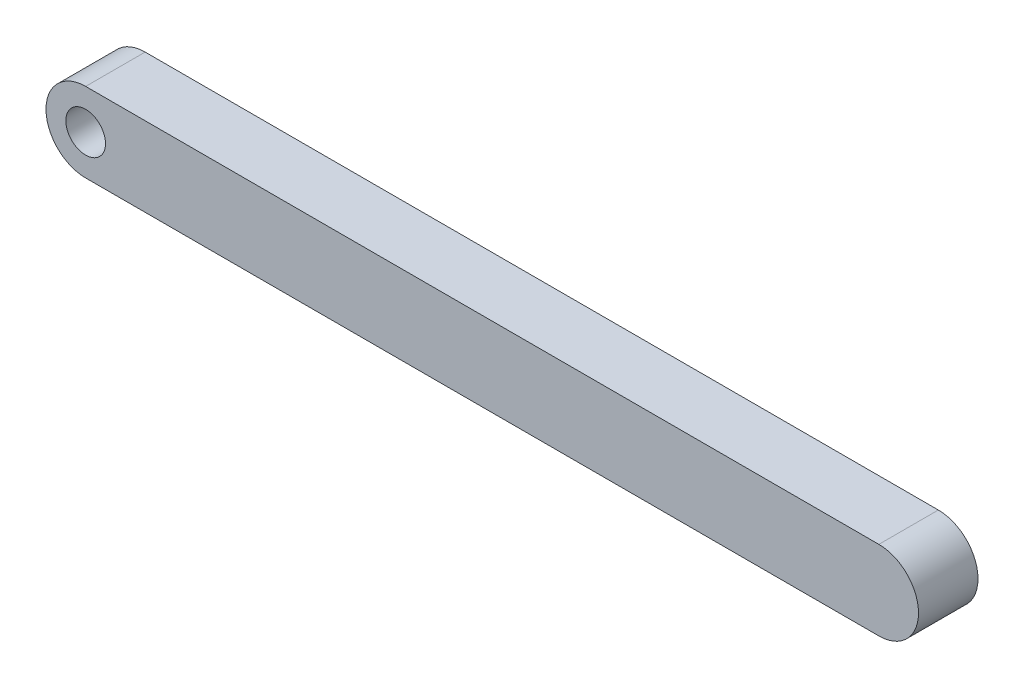
ISO-10303-21;
HEADER;
FILE_DESCRIPTION(('STEP AP214'),'2;1');
FILE_NAME('part.step','',(''),(''),'','','');
FILE_SCHEMA(('AUTOMOTIVE_DESIGN { 1 0 10303 214 1 1 1 1 }'));
ENDSEC;
DATA;
#1=APPLICATION_CONTEXT('core data for automotive mechanical design processes');
#2=APPLICATION_PROTOCOL_DEFINITION('international standard','automotive_design',2000,#1);
#3=PRODUCT_CONTEXT('',#1,'mechanical');
#4=PRODUCT('Part','Part','',(#3));
#5=PRODUCT_RELATED_PRODUCT_CATEGORY('part','',(#4));
#6=PRODUCT_DEFINITION_FORMATION('','',#4);
#7=PRODUCT_DEFINITION_CONTEXT('part definition',#1,'design');
#8=PRODUCT_DEFINITION('design','',#6,#7);
#9=PRODUCT_DEFINITION_SHAPE('','',#8);
#10=(LENGTH_UNIT() NAMED_UNIT(*) SI_UNIT(.MILLI.,.METRE.));
#11=(NAMED_UNIT(*) PLANE_ANGLE_UNIT() SI_UNIT($,.RADIAN.));
#12=(NAMED_UNIT(*) SI_UNIT($,.STERADIAN.) SOLID_ANGLE_UNIT());
#13=UNCERTAINTY_MEASURE_WITH_UNIT(LENGTH_MEASURE(1.E-05),#10,'distance_accuracy_value','');
#14=(GEOMETRIC_REPRESENTATION_CONTEXT(3) GLOBAL_UNCERTAINTY_ASSIGNED_CONTEXT((#13)) GLOBAL_UNIT_ASSIGNED_CONTEXT((#10,
#11,#12)) REPRESENTATION_CONTEXT('',''));
#15=CARTESIAN_POINT('',(0.,0.,0.));
#16=DIRECTION('',(0.,0.,1.));
#17=DIRECTION('',(1.,0.,0.));
#18=AXIS2_PLACEMENT_3D('',#15,#16,#17);
#19=CARTESIAN_POINT('',(0.,0.,1.5));
#20=DIRECTION('',(0.,0.,1.));
#21=DIRECTION('',(1.,0.,0.));
#22=AXIS2_PLACEMENT_3D('',#19,#20,#21);
#23=PLANE('',#22);
#24=CARTESIAN_POINT('',(0.,0.,1.5));
#25=DIRECTION('',(0.,0.,1.));
#26=DIRECTION('',(1.,0.,0.));
#27=AXIS2_PLACEMENT_3D('',#24,#25,#26);
#28=CIRCLE('',#27,2.);
#29=CARTESIAN_POINT('',(0.,2.,1.5));
#30=VERTEX_POINT('',#29);
#31=CARTESIAN_POINT('',(0.,-2.,1.5));
#32=VERTEX_POINT('',#31);
#33=EDGE_CURVE('E87',#30,#32,#28,.T.);
#34=ORIENTED_EDGE('',*,*,#33,.T.);
#35=DIRECTION('',(1.,0.,0.));
#36=VECTOR('',#35,1.);
#37=CARTESIAN_POINT('',(0.,-2.,1.5));
#38=LINE('',#37,#36);
#39=CARTESIAN_POINT('',(40.,-2.,1.5));
#40=VERTEX_POINT('',#39);
#41=EDGE_CURVE('E82',#32,#40,#38,.T.);
#42=ORIENTED_EDGE('',*,*,#41,.T.);
#43=CARTESIAN_POINT('',(40.,0.,1.5));
#44=DIRECTION('',(0.,0.,1.));
#45=DIRECTION('',(1.,0.,0.));
#46=AXIS2_PLACEMENT_3D('',#43,#44,#45);
#47=CIRCLE('',#46,2.);
#48=CARTESIAN_POINT('',(40.,2.,1.5));
#49=VERTEX_POINT('',#48);
#50=EDGE_CURVE('E85',#40,#49,#47,.T.);
#51=ORIENTED_EDGE('',*,*,#50,.T.);
#52=DIRECTION('',(-1.,0.,0.));
#53=VECTOR('',#52,1.);
#54=CARTESIAN_POINT('',(0.,2.,1.5));
#55=LINE('',#54,#53);
#56=EDGE_CURVE('E52',#49,#30,#55,.T.);
#57=ORIENTED_EDGE('',*,*,#56,.T.);
#58=EDGE_LOOP('',(#34,#42,#51,#57));
#59=FACE_BOUND('',#58,.T.);
#60=CARTESIAN_POINT('',(0.,0.,1.5));
#61=DIRECTION('',(0.,0.,1.));
#62=DIRECTION('',(1.,0.,0.));
#63=AXIS2_PLACEMENT_3D('',#60,#61,#62);
#64=CIRCLE('',#63,1.);
#65=CARTESIAN_POINT('',(1.,0.,1.5));
#66=VERTEX_POINT('',#65);
#67=EDGE_CURVE('E102',#66,#66,#64,.T.);
#68=ORIENTED_EDGE('',*,*,#67,.F.);
#69=EDGE_LOOP('',(#68));
#70=FACE_BOUND('',#69,.T.);
#71=ADVANCED_FACE('F35',(#59,#70),#23,.T.);
#72=CARTESIAN_POINT('',(0.,0.,-1.5));
#73=DIRECTION('',(0.,0.,1.));
#74=DIRECTION('',(1.,0.,0.));
#75=AXIS2_PLACEMENT_3D('',#72,#73,#74);
#76=PLANE('',#75);
#77=CARTESIAN_POINT('',(0.,0.,-1.5));
#78=DIRECTION('',(0.,0.,1.));
#79=DIRECTION('',(1.,0.,0.));
#80=AXIS2_PLACEMENT_3D('',#77,#78,#79);
#81=CIRCLE('',#80,2.);
#82=CARTESIAN_POINT('',(0.,2.,-1.5));
#83=VERTEX_POINT('',#82);
#84=CARTESIAN_POINT('',(0.,-2.,-1.5));
#85=VERTEX_POINT('',#84);
#86=EDGE_CURVE('E99',#83,#85,#81,.T.);
#87=ORIENTED_EDGE('',*,*,#86,.F.);
#88=DIRECTION('',(-1.,0.,0.));
#89=VECTOR('',#88,1.);
#90=CARTESIAN_POINT('',(0.,2.,-1.5));
#91=LINE('',#90,#89);
#92=CARTESIAN_POINT('',(40.,2.,-1.5));
#93=VERTEX_POINT('',#92);
#94=EDGE_CURVE('E75',#93,#83,#91,.T.);
#95=ORIENTED_EDGE('',*,*,#94,.F.);
#96=CARTESIAN_POINT('',(40.,0.,-1.5));
#97=DIRECTION('',(0.,0.,1.));
#98=DIRECTION('',(1.,0.,0.));
#99=AXIS2_PLACEMENT_3D('',#96,#97,#98);
#100=CIRCLE('',#99,2.);
#101=CARTESIAN_POINT('',(40.,-2.,-1.5));
#102=VERTEX_POINT('',#101);
#103=EDGE_CURVE('E69',#102,#93,#100,.T.);
#104=ORIENTED_EDGE('',*,*,#103,.F.);
#105=DIRECTION('',(1.,0.,0.));
#106=VECTOR('',#105,1.);
#107=CARTESIAN_POINT('',(0.,-2.,-1.5));
#108=LINE('',#107,#106);
#109=EDGE_CURVE('E91',#85,#102,#108,.T.);
#110=ORIENTED_EDGE('',*,*,#109,.F.);
#111=EDGE_LOOP('',(#87,#95,#104,#110));
#112=FACE_BOUND('',#111,.T.);
#113=CARTESIAN_POINT('',(0.,0.,-1.5));
#114=DIRECTION('',(0.,0.,1.));
#115=DIRECTION('',(1.,0.,0.));
#116=AXIS2_PLACEMENT_3D('',#113,#114,#115);
#117=CIRCLE('',#116,1.);
#118=CARTESIAN_POINT('',(1.,0.,-1.5));
#119=VERTEX_POINT('',#118);
#120=EDGE_CURVE('E114',#119,#119,#117,.T.);
#121=ORIENTED_EDGE('',*,*,#120,.T.);
#122=EDGE_LOOP('',(#121));
#123=FACE_BOUND('',#122,.T.);
#124=ADVANCED_FACE('F110',(#112,#123),#76,.F.);
#125=CARTESIAN_POINT('',(0.,0.,1.5));
#126=DIRECTION('',(0.,0.,-1.));
#127=DIRECTION('',(-1.,0.,0.));
#128=AXIS2_PLACEMENT_3D('',#125,#126,#127);
#129=CYLINDRICAL_SURFACE('',#128,2.);
#130=ORIENTED_EDGE('',*,*,#86,.T.);
#131=DIRECTION('',(0.,0.,-1.));
#132=VECTOR('',#131,1.);
#133=CARTESIAN_POINT('',(0.,-2.,1.5));
#134=LINE('',#133,#132);
#135=EDGE_CURVE('E11',#32,#85,#134,.T.);
#136=ORIENTED_EDGE('',*,*,#135,.F.);
#137=ORIENTED_EDGE('',*,*,#33,.F.);
#138=DIRECTION('',(0.,0.,-1.));
#139=VECTOR('',#138,1.);
#140=CARTESIAN_POINT('',(0.,2.,1.5));
#141=LINE('',#140,#139);
#142=EDGE_CURVE('E95',#30,#83,#141,.T.);
#143=ORIENTED_EDGE('',*,*,#142,.T.);
#144=EDGE_LOOP('',(#130,#136,#137,#143));
#145=FACE_BOUND('',#144,.T.);
#146=ADVANCED_FACE('F37',(#145),#129,.T.);
#147=CARTESIAN_POINT('',(0.,-2.,1.5));
#148=DIRECTION('',(0.,1.,0.));
#149=DIRECTION('',(0.,0.,1.));
#150=AXIS2_PLACEMENT_3D('',#147,#148,#149);
#151=PLANE('',#150);
#152=ORIENTED_EDGE('',*,*,#109,.T.);
#153=DIRECTION('',(0.,0.,-1.));
#154=VECTOR('',#153,1.);
#155=CARTESIAN_POINT('',(40.,-2.,1.5));
#156=LINE('',#155,#154);
#157=EDGE_CURVE('E44',#40,#102,#156,.T.);
#158=ORIENTED_EDGE('',*,*,#157,.F.);
#159=ORIENTED_EDGE('',*,*,#41,.F.);
#160=ORIENTED_EDGE('',*,*,#135,.T.);
#161=EDGE_LOOP('',(#152,#158,#159,#160));
#162=FACE_BOUND('',#161,.T.);
#163=ADVANCED_FACE('F90',(#162),#151,.F.);
#164=CARTESIAN_POINT('',(40.,0.,1.5));
#165=DIRECTION('',(0.,0.,-1.));
#166=DIRECTION('',(-1.,0.,0.));
#167=AXIS2_PLACEMENT_3D('',#164,#165,#166);
#168=CYLINDRICAL_SURFACE('',#167,2.);
#169=ORIENTED_EDGE('',*,*,#103,.T.);
#170=DIRECTION('',(0.,0.,-1.));
#171=VECTOR('',#170,1.);
#172=CARTESIAN_POINT('',(40.,2.,1.5));
#173=LINE('',#172,#171);
#174=EDGE_CURVE('E92',#49,#93,#173,.T.);
#175=ORIENTED_EDGE('',*,*,#174,.F.);
#176=ORIENTED_EDGE('',*,*,#50,.F.);
#177=ORIENTED_EDGE('',*,*,#157,.T.);
#178=EDGE_LOOP('',(#169,#175,#176,#177));
#179=FACE_BOUND('',#178,.T.);
#180=ADVANCED_FACE('F93',(#179),#168,.T.);
#181=CARTESIAN_POINT('',(0.,2.,1.5));
#182=DIRECTION('',(0.,-1.,0.));
#183=DIRECTION('',(0.,0.,-1.));
#184=AXIS2_PLACEMENT_3D('',#181,#182,#183);
#185=PLANE('',#184);
#186=ORIENTED_EDGE('',*,*,#94,.T.);
#187=ORIENTED_EDGE('',*,*,#142,.F.);
#188=ORIENTED_EDGE('',*,*,#56,.F.);
#189=ORIENTED_EDGE('',*,*,#174,.T.);
#190=EDGE_LOOP('',(#186,#187,#188,#189));
#191=FACE_BOUND('',#190,.T.);
#192=ADVANCED_FACE('F107',(#191),#185,.F.);
#193=CARTESIAN_POINT('',(0.,0.,1.5));
#194=DIRECTION('',(0.,0.,-1.));
#195=DIRECTION('',(-1.,0.,0.));
#196=AXIS2_PLACEMENT_3D('',#193,#194,#195);
#197=CYLINDRICAL_SURFACE('',#196,1.);
#198=ORIENTED_EDGE('',*,*,#67,.T.);
#199=EDGE_LOOP('',(#198));
#200=FACE_BOUND('',#199,.T.);
#201=ORIENTED_EDGE('',*,*,#120,.F.);
#202=EDGE_LOOP('',(#201));
#203=FACE_BOUND('',#202,.T.);
#204=ADVANCED_FACE('F120',(#200,#203),#197,.F.);
#205=CLOSED_SHELL('',(#71,#124,#146,#163,#180,#192,#204));
#206=MANIFOLD_SOLID_BREP('B2',#205);
#207=ADVANCED_BREP_SHAPE_REPRESENTATION('',(#18,#206),#14);
#208=SHAPE_DEFINITION_REPRESENTATION(#9,#207);
ENDSEC;
END-ISO-10303-21;
